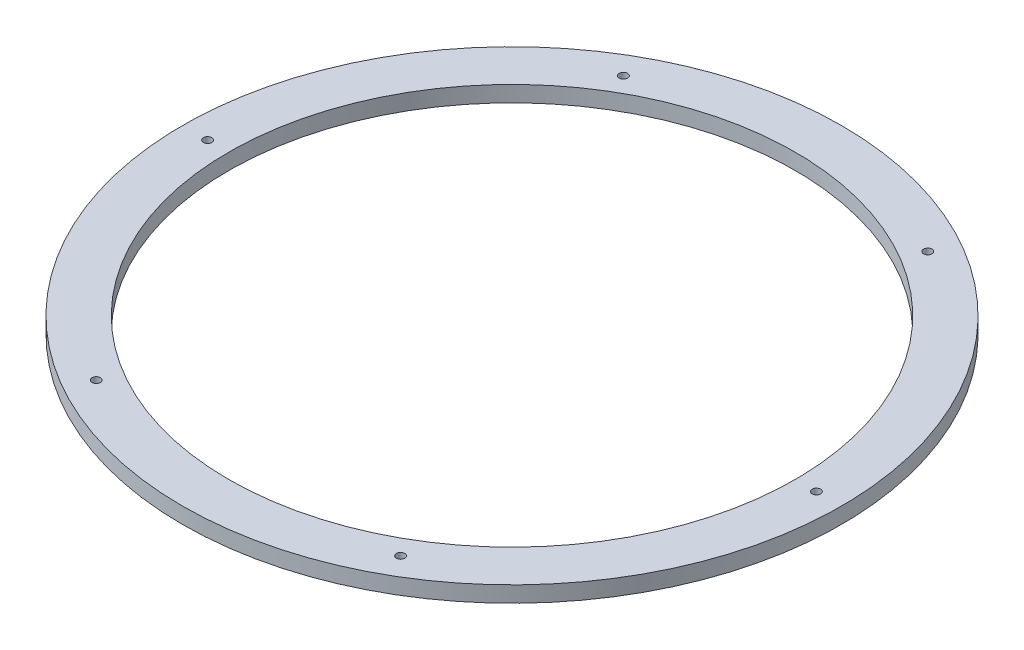
ISO-10303-21;
HEADER;
FILE_DESCRIPTION(('STEP AP214'),'2;1');
FILE_NAME('part.step','',(''),(''),'','','');
FILE_SCHEMA(('AUTOMOTIVE_DESIGN { 1 0 10303 214 1 1 1 1 }'));
ENDSEC;
DATA;
#1=APPLICATION_CONTEXT('core data for automotive mechanical design processes');
#2=APPLICATION_PROTOCOL_DEFINITION('international standard','automotive_design',2000,#1);
#3=PRODUCT_CONTEXT('',#1,'mechanical');
#4=PRODUCT('Part','Part','',(#3));
#5=PRODUCT_RELATED_PRODUCT_CATEGORY('part','',(#4));
#6=PRODUCT_DEFINITION_FORMATION('','',#4);
#7=PRODUCT_DEFINITION_CONTEXT('part definition',#1,'design');
#8=PRODUCT_DEFINITION('design','',#6,#7);
#9=PRODUCT_DEFINITION_SHAPE('','',#8);
#10=(LENGTH_UNIT() NAMED_UNIT(*) SI_UNIT(.MILLI.,.METRE.));
#11=(NAMED_UNIT(*) PLANE_ANGLE_UNIT() SI_UNIT($,.RADIAN.));
#12=(NAMED_UNIT(*) SI_UNIT($,.STERADIAN.) SOLID_ANGLE_UNIT());
#13=UNCERTAINTY_MEASURE_WITH_UNIT(LENGTH_MEASURE(1.E-05),#10,'distance_accuracy_value','');
#14=(GEOMETRIC_REPRESENTATION_CONTEXT(3) GLOBAL_UNCERTAINTY_ASSIGNED_CONTEXT((#13)) GLOBAL_UNIT_ASSIGNED_CONTEXT((#10,
#11,#12)) REPRESENTATION_CONTEXT('',''));
#15=CARTESIAN_POINT('',(0.,0.,0.));
#16=DIRECTION('',(0.,0.,1.));
#17=DIRECTION('',(1.,0.,0.));
#18=AXIS2_PLACEMENT_3D('',#15,#16,#17);
#19=CARTESIAN_POINT('',(0.,9.5,0.));
#20=DIRECTION('',(0.,1.,0.));
#21=DIRECTION('',(0.,0.,1.));
#22=AXIS2_PLACEMENT_3D('',#19,#20,#21);
#23=PLANE('',#22);
#24=CARTESIAN_POINT('',(-181.25,9.5,-313.934208871847));
#25=DIRECTION('',(0.,1.,0.));
#26=DIRECTION('',(0.,0.,1.));
#27=AXIS2_PLACEMENT_3D('',#24,#25,#26);
#28=CIRCLE('',#27,4.99999999999984);
#29=CARTESIAN_POINT('',(-181.25,9.5,-308.934208871847));
#30=VERTEX_POINT('',#29);
#31=EDGE_CURVE('E57',#30,#30,#28,.T.);
#32=ORIENTED_EDGE('',*,*,#31,.F.);
#33=EDGE_LOOP('',(#32));
#34=FACE_BOUND('',#33,.T.);
#35=CARTESIAN_POINT('',(-362.499999999989,9.5,1.85439422950494E-11));
#36=DIRECTION('',(0.,1.,0.));
#37=DIRECTION('',(0.,0.,1.));
#38=AXIS2_PLACEMENT_3D('',#35,#36,#37);
#39=CIRCLE('',#38,4.99999999999982);
#40=CARTESIAN_POINT('',(-362.499999999989,9.5,5.00000000001836));
#41=VERTEX_POINT('',#40);
#42=EDGE_CURVE('E63',#41,#41,#39,.T.);
#43=ORIENTED_EDGE('',*,*,#42,.F.);
#44=EDGE_LOOP('',(#43));
#45=FACE_BOUND('',#44,.T.);
#46=CARTESIAN_POINT('',(-181.249999999979,9.5,313.934208871871));
#47=DIRECTION('',(0.,1.,0.));
#48=DIRECTION('',(0.,0.,1.));
#49=AXIS2_PLACEMENT_3D('',#46,#47,#48);
#50=CIRCLE('',#49,4.99999999999982);
#51=CARTESIAN_POINT('',(-181.249999999979,9.5,318.934208871871));
#52=VERTEX_POINT('',#51);
#53=EDGE_CURVE('E69',#52,#52,#50,.T.);
#54=ORIENTED_EDGE('',*,*,#53,.F.);
#55=EDGE_LOOP('',(#54));
#56=FACE_BOUND('',#55,.T.);
#57=CARTESIAN_POINT('',(181.250000000021,9.5,313.934208871859));
#58=DIRECTION('',(0.,1.,0.));
#59=DIRECTION('',(0.,0.,1.));
#60=AXIS2_PLACEMENT_3D('',#57,#58,#59);
#61=CIRCLE('',#60,4.99999999999976);
#62=CARTESIAN_POINT('',(181.250000000021,9.5,318.934208871859));
#63=VERTEX_POINT('',#62);
#64=EDGE_CURVE('E75',#63,#63,#61,.T.);
#65=ORIENTED_EDGE('',*,*,#64,.F.);
#66=EDGE_LOOP('',(#65));
#67=FACE_BOUND('',#66,.T.);
#68=CARTESIAN_POINT('',(362.500000000011,9.5,-5.85617479175502E-12));
#69=DIRECTION('',(0.,1.,0.));
#70=DIRECTION('',(0.,0.,1.));
#71=AXIS2_PLACEMENT_3D('',#68,#69,#70);
#72=CIRCLE('',#71,4.99999999999976);
#73=CARTESIAN_POINT('',(362.500000000011,9.5,4.9999999999939));
#74=VERTEX_POINT('',#73);
#75=EDGE_CURVE('E81',#74,#74,#72,.T.);
#76=ORIENTED_EDGE('',*,*,#75,.F.);
#77=EDGE_LOOP('',(#76));
#78=FACE_BOUND('',#77,.T.);
#79=CARTESIAN_POINT('',(181.25,9.5,-313.934208871859));
#80=DIRECTION('',(0.,1.,0.));
#81=DIRECTION('',(0.,0.,1.));
#82=AXIS2_PLACEMENT_3D('',#79,#80,#81);
#83=CIRCLE('',#82,4.99999999999982);
#84=CARTESIAN_POINT('',(181.25,9.5,-308.934208871859));
#85=VERTEX_POINT('',#84);
#86=EDGE_CURVE('E51',#85,#85,#83,.T.);
#87=ORIENTED_EDGE('',*,*,#86,.F.);
#88=EDGE_LOOP('',(#87));
#89=FACE_BOUND('',#88,.T.);
#90=CARTESIAN_POINT('',(0.,9.5,0.));
#91=DIRECTION('',(0.,1.,0.));
#92=DIRECTION('',(0.,0.,1.));
#93=AXIS2_PLACEMENT_3D('',#90,#91,#92);
#94=CIRCLE('',#93,392.5);
#95=CARTESIAN_POINT('',(0.,9.5,392.5));
#96=VERTEX_POINT('',#95);
#97=EDGE_CURVE('E10',#96,#96,#94,.T.);
#98=ORIENTED_EDGE('',*,*,#97,.T.);
#99=EDGE_LOOP('',(#98));
#100=FACE_BOUND('',#99,.T.);
#101=CARTESIAN_POINT('',(0.,9.5,0.));
#102=DIRECTION('',(0.,1.,0.));
#103=DIRECTION('',(0.,0.,1.));
#104=AXIS2_PLACEMENT_3D('',#101,#102,#103);
#105=CIRCLE('',#104,337.5);
#106=CARTESIAN_POINT('',(0.,9.5,337.5));
#107=VERTEX_POINT('',#106);
#108=EDGE_CURVE('E43',#107,#107,#105,.T.);
#109=ORIENTED_EDGE('',*,*,#108,.F.);
#110=EDGE_LOOP('',(#109));
#111=FACE_BOUND('',#110,.T.);
#112=ADVANCED_FACE('F32',(#34,#45,#56,#67,#78,#89,#100,#111),#23,.T.);
#113=CARTESIAN_POINT('',(0.,-9.5,0.));
#114=DIRECTION('',(0.,1.,0.));
#115=DIRECTION('',(0.,0.,1.));
#116=AXIS2_PLACEMENT_3D('',#113,#114,#115);
#117=PLANE('',#116);
#118=CARTESIAN_POINT('',(-181.25,-9.5,-313.934208871847));
#119=DIRECTION('',(0.,1.,0.));
#120=DIRECTION('',(0.,0.,1.));
#121=AXIS2_PLACEMENT_3D('',#118,#119,#120);
#122=CIRCLE('',#121,4.99999999999984);
#123=CARTESIAN_POINT('',(-181.25,-9.5,-308.934208871847));
#124=VERTEX_POINT('',#123);
#125=EDGE_CURVE('E60',#124,#124,#122,.T.);
#126=ORIENTED_EDGE('',*,*,#125,.T.);
#127=EDGE_LOOP('',(#126));
#128=FACE_BOUND('',#127,.T.);
#129=CARTESIAN_POINT('',(-362.499999999989,-9.5,1.85439422950494E-11));
#130=DIRECTION('',(0.,1.,0.));
#131=DIRECTION('',(0.,0.,1.));
#132=AXIS2_PLACEMENT_3D('',#129,#130,#131);
#133=CIRCLE('',#132,4.99999999999982);
#134=CARTESIAN_POINT('',(-362.499999999989,-9.5,5.00000000001836));
#135=VERTEX_POINT('',#134);
#136=EDGE_CURVE('E66',#135,#135,#133,.T.);
#137=ORIENTED_EDGE('',*,*,#136,.T.);
#138=EDGE_LOOP('',(#137));
#139=FACE_BOUND('',#138,.T.);
#140=CARTESIAN_POINT('',(-181.249999999979,-9.5,313.934208871871));
#141=DIRECTION('',(0.,1.,0.));
#142=DIRECTION('',(0.,0.,1.));
#143=AXIS2_PLACEMENT_3D('',#140,#141,#142);
#144=CIRCLE('',#143,4.99999999999982);
#145=CARTESIAN_POINT('',(-181.249999999979,-9.5,318.934208871871));
#146=VERTEX_POINT('',#145);
#147=EDGE_CURVE('E72',#146,#146,#144,.T.);
#148=ORIENTED_EDGE('',*,*,#147,.T.);
#149=EDGE_LOOP('',(#148));
#150=FACE_BOUND('',#149,.T.);
#151=CARTESIAN_POINT('',(181.250000000021,-9.5,313.934208871859));
#152=DIRECTION('',(0.,1.,0.));
#153=DIRECTION('',(0.,0.,1.));
#154=AXIS2_PLACEMENT_3D('',#151,#152,#153);
#155=CIRCLE('',#154,4.99999999999976);
#156=CARTESIAN_POINT('',(181.250000000021,-9.5,318.934208871859));
#157=VERTEX_POINT('',#156);
#158=EDGE_CURVE('E78',#157,#157,#155,.T.);
#159=ORIENTED_EDGE('',*,*,#158,.T.);
#160=EDGE_LOOP('',(#159));
#161=FACE_BOUND('',#160,.T.);
#162=CARTESIAN_POINT('',(362.500000000011,-9.5,-5.85617479175502E-12));
#163=DIRECTION('',(0.,1.,0.));
#164=DIRECTION('',(0.,0.,1.));
#165=AXIS2_PLACEMENT_3D('',#162,#163,#164);
#166=CIRCLE('',#165,4.99999999999976);
#167=CARTESIAN_POINT('',(362.500000000011,-9.5,4.9999999999939));
#168=VERTEX_POINT('',#167);
#169=EDGE_CURVE('E54',#168,#168,#166,.T.);
#170=ORIENTED_EDGE('',*,*,#169,.T.);
#171=EDGE_LOOP('',(#170));
#172=FACE_BOUND('',#171,.T.);
#173=CARTESIAN_POINT('',(181.25,-9.5,-313.934208871859));
#174=DIRECTION('',(0.,1.,0.));
#175=DIRECTION('',(0.,0.,1.));
#176=AXIS2_PLACEMENT_3D('',#173,#174,#175);
#177=CIRCLE('',#176,4.99999999999982);
#178=CARTESIAN_POINT('',(181.25,-9.5,-308.934208871859));
#179=VERTEX_POINT('',#178);
#180=EDGE_CURVE('E48',#179,#179,#177,.T.);
#181=ORIENTED_EDGE('',*,*,#180,.T.);
#182=EDGE_LOOP('',(#181));
#183=FACE_BOUND('',#182,.T.);
#184=CARTESIAN_POINT('',(0.,-9.5,0.));
#185=DIRECTION('',(0.,1.,0.));
#186=DIRECTION('',(0.,0.,1.));
#187=AXIS2_PLACEMENT_3D('',#184,#185,#186);
#188=CIRCLE('',#187,392.5);
#189=CARTESIAN_POINT('',(0.,-9.5,392.5));
#190=VERTEX_POINT('',#189);
#191=EDGE_CURVE('E36',#190,#190,#188,.T.);
#192=ORIENTED_EDGE('',*,*,#191,.F.);
#193=EDGE_LOOP('',(#192));
#194=FACE_BOUND('',#193,.T.);
#195=CARTESIAN_POINT('',(0.,-9.5,0.));
#196=DIRECTION('',(0.,1.,0.));
#197=DIRECTION('',(0.,0.,1.));
#198=AXIS2_PLACEMENT_3D('',#195,#196,#197);
#199=CIRCLE('',#198,337.5);
#200=CARTESIAN_POINT('',(0.,-9.5,337.5));
#201=VERTEX_POINT('',#200);
#202=EDGE_CURVE('E45',#201,#201,#199,.T.);
#203=ORIENTED_EDGE('',*,*,#202,.T.);
#204=EDGE_LOOP('',(#203));
#205=FACE_BOUND('',#204,.T.);
#206=ADVANCED_FACE('F87',(#128,#139,#150,#161,#172,#183,#194,#205),#117,.F.);
#207=CARTESIAN_POINT('',(0.,9.5,0.));
#208=DIRECTION('',(0.,-1.,0.));
#209=DIRECTION('',(0.,0.,-1.));
#210=AXIS2_PLACEMENT_3D('',#207,#208,#209);
#211=CYLINDRICAL_SURFACE('',#210,392.5);
#212=ORIENTED_EDGE('',*,*,#97,.F.);
#213=EDGE_LOOP('',(#212));
#214=FACE_BOUND('',#213,.T.);
#215=ORIENTED_EDGE('',*,*,#191,.T.);
#216=EDGE_LOOP('',(#215));
#217=FACE_BOUND('',#216,.T.);
#218=ADVANCED_FACE('F34',(#214,#217),#211,.T.);
#219=CARTESIAN_POINT('',(0.,9.5,0.));
#220=DIRECTION('',(0.,-1.,0.));
#221=DIRECTION('',(0.,0.,-1.));
#222=AXIS2_PLACEMENT_3D('',#219,#220,#221);
#223=CYLINDRICAL_SURFACE('',#222,337.5);
#224=ORIENTED_EDGE('',*,*,#108,.T.);
#225=EDGE_LOOP('',(#224));
#226=FACE_BOUND('',#225,.T.);
#227=ORIENTED_EDGE('',*,*,#202,.F.);
#228=EDGE_LOOP('',(#227));
#229=FACE_BOUND('',#228,.T.);
#230=ADVANCED_FACE('F106',(#226,#229),#223,.F.);
#231=CARTESIAN_POINT('',(181.25,-9.5,-313.934208871859));
#232=DIRECTION('',(0.,1.,0.));
#233=DIRECTION('',(0.,0.,1.));
#234=AXIS2_PLACEMENT_3D('',#231,#232,#233);
#235=CYLINDRICAL_SURFACE('',#234,4.99999999999982);
#236=ORIENTED_EDGE('',*,*,#180,.F.);
#237=EDGE_LOOP('',(#236));
#238=FACE_BOUND('',#237,.T.);
#239=ORIENTED_EDGE('',*,*,#86,.T.);
#240=EDGE_LOOP('',(#239));
#241=FACE_BOUND('',#240,.T.);
#242=ADVANCED_FACE('F94',(#238,#241),#235,.F.);
#243=CARTESIAN_POINT('',(362.500000000011,-9.5,-5.85617479175502E-12));
#244=DIRECTION('',(0.,1.,0.));
#245=DIRECTION('',(0.,0.,1.));
#246=AXIS2_PLACEMENT_3D('',#243,#244,#245);
#247=CYLINDRICAL_SURFACE('',#246,4.99999999999976);
#248=ORIENTED_EDGE('',*,*,#169,.F.);
#249=EDGE_LOOP('',(#248));
#250=FACE_BOUND('',#249,.T.);
#251=ORIENTED_EDGE('',*,*,#75,.T.);
#252=EDGE_LOOP('',(#251));
#253=FACE_BOUND('',#252,.T.);
#254=ADVANCED_FACE('F90',(#250,#253),#247,.F.);
#255=CARTESIAN_POINT('',(181.250000000021,-9.5,313.934208871859));
#256=DIRECTION('',(0.,1.,0.));
#257=DIRECTION('',(0.,0.,1.));
#258=AXIS2_PLACEMENT_3D('',#255,#256,#257);
#259=CYLINDRICAL_SURFACE('',#258,4.99999999999976);
#260=ORIENTED_EDGE('',*,*,#158,.F.);
#261=EDGE_LOOP('',(#260));
#262=FACE_BOUND('',#261,.T.);
#263=ORIENTED_EDGE('',*,*,#64,.T.);
#264=EDGE_LOOP('',(#263));
#265=FACE_BOUND('',#264,.T.);
#266=ADVANCED_FACE('F93',(#262,#265),#259,.F.);
#267=CARTESIAN_POINT('',(-181.249999999979,-9.5,313.934208871871));
#268=DIRECTION('',(0.,1.,0.));
#269=DIRECTION('',(0.,0.,1.));
#270=AXIS2_PLACEMENT_3D('',#267,#268,#269);
#271=CYLINDRICAL_SURFACE('',#270,4.99999999999982);
#272=ORIENTED_EDGE('',*,*,#147,.F.);
#273=EDGE_LOOP('',(#272));
#274=FACE_BOUND('',#273,.T.);
#275=ORIENTED_EDGE('',*,*,#53,.T.);
#276=EDGE_LOOP('',(#275));
#277=FACE_BOUND('',#276,.T.);
#278=ADVANCED_FACE('F130',(#274,#277),#271,.F.);
#279=CARTESIAN_POINT('',(-362.499999999989,-9.5,1.85439422950494E-11));
#280=DIRECTION('',(0.,1.,0.));
#281=DIRECTION('',(0.,0.,1.));
#282=AXIS2_PLACEMENT_3D('',#279,#280,#281);
#283=CYLINDRICAL_SURFACE('',#282,4.99999999999982);
#284=ORIENTED_EDGE('',*,*,#136,.F.);
#285=EDGE_LOOP('',(#284));
#286=FACE_BOUND('',#285,.T.);
#287=ORIENTED_EDGE('',*,*,#42,.T.);
#288=EDGE_LOOP('',(#287));
#289=FACE_BOUND('',#288,.T.);
#290=ADVANCED_FACE('F126',(#286,#289),#283,.F.);
#291=CARTESIAN_POINT('',(-181.25,-9.5,-313.934208871847));
#292=DIRECTION('',(0.,1.,0.));
#293=DIRECTION('',(0.,0.,1.));
#294=AXIS2_PLACEMENT_3D('',#291,#292,#293);
#295=CYLINDRICAL_SURFACE('',#294,4.99999999999984);
#296=ORIENTED_EDGE('',*,*,#125,.F.);
#297=EDGE_LOOP('',(#296));
#298=FACE_BOUND('',#297,.T.);
#299=ORIENTED_EDGE('',*,*,#31,.T.);
#300=EDGE_LOOP('',(#299));
#301=FACE_BOUND('',#300,.T.);
#302=ADVANCED_FACE('F123',(#298,#301),#295,.F.);
#303=CLOSED_SHELL('',(#112,#206,#218,#230,#242,#254,#266,#278,#290,#302));
#304=MANIFOLD_SOLID_BREP('B2',#303);
#305=ADVANCED_BREP_SHAPE_REPRESENTATION('',(#18,#304),#14);
#306=SHAPE_DEFINITION_REPRESENTATION(#9,#305);
ENDSEC;
END-ISO-10303-21;
